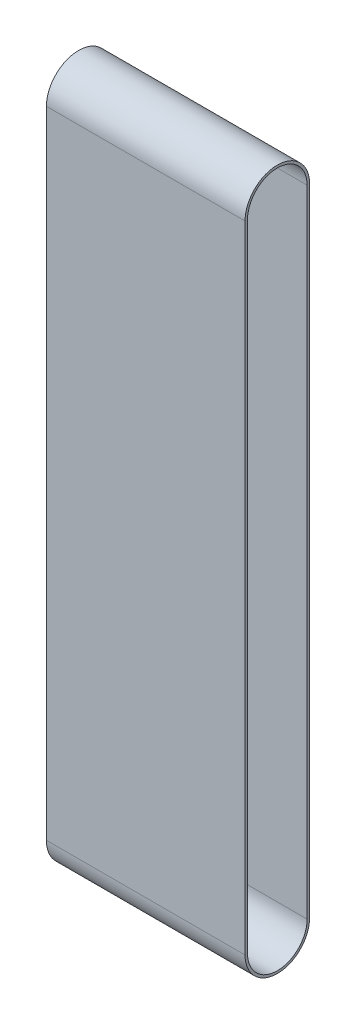
ISO-10303-21;
HEADER;
FILE_DESCRIPTION(('STEP AP214'),'2;1');
FILE_NAME('part.step','',(''),(''),'','','');
FILE_SCHEMA(('AUTOMOTIVE_DESIGN { 1 0 10303 214 1 1 1 1 }'));
ENDSEC;
DATA;
#1=APPLICATION_CONTEXT('core data for automotive mechanical design processes');
#2=APPLICATION_PROTOCOL_DEFINITION('international standard','automotive_design',2000,#1);
#3=PRODUCT_CONTEXT('',#1,'mechanical');
#4=PRODUCT('Part','Part','',(#3));
#5=PRODUCT_RELATED_PRODUCT_CATEGORY('part','',(#4));
#6=PRODUCT_DEFINITION_FORMATION('','',#4);
#7=PRODUCT_DEFINITION_CONTEXT('part definition',#1,'design');
#8=PRODUCT_DEFINITION('design','',#6,#7);
#9=PRODUCT_DEFINITION_SHAPE('','',#8);
#10=(LENGTH_UNIT() NAMED_UNIT(*) SI_UNIT(.MILLI.,.METRE.));
#11=(NAMED_UNIT(*) PLANE_ANGLE_UNIT() SI_UNIT($,.RADIAN.));
#12=(NAMED_UNIT(*) SI_UNIT($,.STERADIAN.) SOLID_ANGLE_UNIT());
#13=UNCERTAINTY_MEASURE_WITH_UNIT(LENGTH_MEASURE(1.E-05),#10,'distance_accuracy_value','');
#14=(GEOMETRIC_REPRESENTATION_CONTEXT(3) GLOBAL_UNCERTAINTY_ASSIGNED_CONTEXT((#13)) GLOBAL_UNIT_ASSIGNED_CONTEXT((#10,
#11,#12)) REPRESENTATION_CONTEXT('',''));
#15=CARTESIAN_POINT('',(0.,0.,0.));
#16=DIRECTION('',(0.,0.,1.));
#17=DIRECTION('',(1.,0.,0.));
#18=AXIS2_PLACEMENT_3D('',#15,#16,#17);
#19=CARTESIAN_POINT('',(254.,254.,-330.2));
#20=DIRECTION('',(1.,0.,0.));
#21=DIRECTION('',(0.,0.,-1.));
#22=AXIS2_PLACEMENT_3D('',#19,#20,#21);
#23=PLANE('',#22);
#24=CARTESIAN_POINT('',(254.,254.,-330.2));
#25=DIRECTION('',(1.,0.,0.));
#26=DIRECTION('',(0.,0.,-1.));
#27=AXIS2_PLACEMENT_3D('',#24,#25,#26);
#28=CIRCLE('',#27,82.5500000000001);
#29=CARTESIAN_POINT('',(254.,254.,-247.65));
#30=VERTEX_POINT('',#29);
#31=CARTESIAN_POINT('',(254.,254.,-412.750000000001));
#32=VERTEX_POINT('',#31);
#33=EDGE_CURVE('E136',#30,#32,#28,.T.);
#34=ORIENTED_EDGE('',*,*,#33,.T.);
#35=DIRECTION('',(0.,1.,0.));
#36=VECTOR('',#35,1.);
#37=CARTESIAN_POINT('',(254.,1879.6,-412.75));
#38=LINE('',#37,#36);
#39=CARTESIAN_POINT('',(254.,1879.6,-412.75));
#40=VERTEX_POINT('',#39);
#41=EDGE_CURVE('E139',#32,#40,#38,.T.);
#42=ORIENTED_EDGE('',*,*,#41,.T.);
#43=CARTESIAN_POINT('',(254.,1879.6,-330.2));
#44=DIRECTION('',(1.,0.,0.));
#45=DIRECTION('',(0.,0.,-1.));
#46=AXIS2_PLACEMENT_3D('',#43,#44,#45);
#47=CIRCLE('',#46,82.55);
#48=CARTESIAN_POINT('',(254.,1879.6,-247.65));
#49=VERTEX_POINT('',#48);
#50=EDGE_CURVE('E142',#40,#49,#47,.T.);
#51=ORIENTED_EDGE('',*,*,#50,.T.);
#52=DIRECTION('',(0.,-1.,0.));
#53=VECTOR('',#52,1.);
#54=CARTESIAN_POINT('',(254.,254.,-247.65));
#55=LINE('',#54,#53);
#56=EDGE_CURVE('E144',#49,#30,#55,.T.);
#57=ORIENTED_EDGE('',*,*,#56,.T.);
#58=EDGE_LOOP('',(#34,#42,#51,#57));
#59=FACE_BOUND('',#58,.T.);
#60=DIRECTION('',(0.,-1.,0.));
#61=VECTOR('',#60,1.);
#62=CARTESIAN_POINT('',(254.,254.,-254.));
#63=LINE('',#62,#61);
#64=CARTESIAN_POINT('',(254.,1879.6,-254.));
#65=VERTEX_POINT('',#64);
#66=CARTESIAN_POINT('',(254.,254.,-254.));
#67=VERTEX_POINT('',#66);
#68=EDGE_CURVE('E108',#65,#67,#63,.T.);
#69=ORIENTED_EDGE('',*,*,#68,.F.);
#70=CARTESIAN_POINT('',(254.,1879.6,-330.2));
#71=DIRECTION('',(1.,0.,0.));
#72=DIRECTION('',(0.,0.,-1.));
#73=AXIS2_PLACEMENT_3D('',#70,#71,#72);
#74=CIRCLE('',#73,76.2);
#75=CARTESIAN_POINT('',(254.,1879.6,-406.4));
#76=VERTEX_POINT('',#75);
#77=EDGE_CURVE('E100',#76,#65,#74,.T.);
#78=ORIENTED_EDGE('',*,*,#77,.F.);
#79=DIRECTION('',(0.,1.,0.));
#80=VECTOR('',#79,1.);
#81=CARTESIAN_POINT('',(254.,1879.6,-406.4));
#82=LINE('',#81,#80);
#83=CARTESIAN_POINT('',(254.,254.,-406.400000000001));
#84=VERTEX_POINT('',#83);
#85=EDGE_CURVE('E122',#84,#76,#82,.T.);
#86=ORIENTED_EDGE('',*,*,#85,.F.);
#87=CARTESIAN_POINT('',(254.,254.,-330.2));
#88=DIRECTION('',(1.,0.,0.));
#89=DIRECTION('',(0.,0.,-1.));
#90=AXIS2_PLACEMENT_3D('',#87,#88,#89);
#91=CIRCLE('',#90,76.2000000000001);
#92=EDGE_CURVE('E120',#67,#84,#91,.T.);
#93=ORIENTED_EDGE('',*,*,#92,.F.);
#94=EDGE_LOOP('',(#69,#78,#86,#93));
#95=FACE_BOUND('',#94,.T.);
#96=ADVANCED_FACE('F35',(#59,#95),#23,.T.);
#97=CARTESIAN_POINT('',(-254.,254.,-330.2));
#98=DIRECTION('',(1.,0.,0.));
#99=DIRECTION('',(0.,0.,-1.));
#100=AXIS2_PLACEMENT_3D('',#97,#98,#99);
#101=PLANE('',#100);
#102=CARTESIAN_POINT('',(-254.,254.,-330.2));
#103=DIRECTION('',(1.,0.,0.));
#104=DIRECTION('',(0.,0.,-1.));
#105=AXIS2_PLACEMENT_3D('',#102,#103,#104);
#106=CIRCLE('',#105,82.5500000000001);
#107=CARTESIAN_POINT('',(-254.,254.,-247.65));
#108=VERTEX_POINT('',#107);
#109=CARTESIAN_POINT('',(-254.,254.,-412.750000000001));
#110=VERTEX_POINT('',#109);
#111=EDGE_CURVE('E116',#108,#110,#106,.T.);
#112=ORIENTED_EDGE('',*,*,#111,.F.);
#113=DIRECTION('',(0.,-1.,0.));
#114=VECTOR('',#113,1.);
#115=CARTESIAN_POINT('',(-254.,254.,-247.65));
#116=LINE('',#115,#114);
#117=CARTESIAN_POINT('',(-254.,1879.6,-247.65));
#118=VERTEX_POINT('',#117);
#119=EDGE_CURVE('E140',#118,#108,#116,.T.);
#120=ORIENTED_EDGE('',*,*,#119,.F.);
#121=CARTESIAN_POINT('',(-254.,1879.6,-330.2));
#122=DIRECTION('',(1.,0.,0.));
#123=DIRECTION('',(0.,0.,-1.));
#124=AXIS2_PLACEMENT_3D('',#121,#122,#123);
#125=CIRCLE('',#124,82.55);
#126=CARTESIAN_POINT('',(-254.,1879.6,-412.75));
#127=VERTEX_POINT('',#126);
#128=EDGE_CURVE('E151',#127,#118,#125,.T.);
#129=ORIENTED_EDGE('',*,*,#128,.F.);
#130=DIRECTION('',(0.,1.,0.));
#131=VECTOR('',#130,1.);
#132=CARTESIAN_POINT('',(-254.,1879.6,-412.75));
#133=LINE('',#132,#131);
#134=EDGE_CURVE('E149',#110,#127,#133,.T.);
#135=ORIENTED_EDGE('',*,*,#134,.F.);
#136=EDGE_LOOP('',(#112,#120,#129,#135));
#137=FACE_BOUND('',#136,.T.);
#138=CARTESIAN_POINT('',(-254.,1879.6,-330.2));
#139=DIRECTION('',(1.,0.,0.));
#140=DIRECTION('',(0.,0.,-1.));
#141=AXIS2_PLACEMENT_3D('',#138,#139,#140);
#142=CIRCLE('',#141,76.2);
#143=CARTESIAN_POINT('',(-254.,1879.6,-406.4));
#144=VERTEX_POINT('',#143);
#145=CARTESIAN_POINT('',(-254.,1879.6,-254.));
#146=VERTEX_POINT('',#145);
#147=EDGE_CURVE('E58',#144,#146,#142,.T.);
#148=ORIENTED_EDGE('',*,*,#147,.T.);
#149=DIRECTION('',(0.,-1.,0.));
#150=VECTOR('',#149,1.);
#151=CARTESIAN_POINT('',(-254.,254.,-254.));
#152=LINE('',#151,#150);
#153=CARTESIAN_POINT('',(-254.,254.,-254.));
#154=VERTEX_POINT('',#153);
#155=EDGE_CURVE('E115',#146,#154,#152,.T.);
#156=ORIENTED_EDGE('',*,*,#155,.T.);
#157=CARTESIAN_POINT('',(-254.,254.,-330.2));
#158=DIRECTION('',(1.,0.,0.));
#159=DIRECTION('',(0.,0.,-1.));
#160=AXIS2_PLACEMENT_3D('',#157,#158,#159);
#161=CIRCLE('',#160,76.2000000000001);
#162=CARTESIAN_POINT('',(-254.,254.,-406.400000000001));
#163=VERTEX_POINT('',#162);
#164=EDGE_CURVE('E128',#154,#163,#161,.T.);
#165=ORIENTED_EDGE('',*,*,#164,.T.);
#166=DIRECTION('',(0.,1.,0.));
#167=VECTOR('',#166,1.);
#168=CARTESIAN_POINT('',(-254.,1879.6,-406.4));
#169=LINE('',#168,#167);
#170=EDGE_CURVE('E109',#163,#144,#169,.T.);
#171=ORIENTED_EDGE('',*,*,#170,.T.);
#172=EDGE_LOOP('',(#148,#156,#165,#171));
#173=FACE_BOUND('',#172,.T.);
#174=ADVANCED_FACE('F169',(#137,#173),#101,.F.);
#175=CARTESIAN_POINT('',(254.,254.,-330.2));
#176=DIRECTION('',(-1.,0.,0.));
#177=DIRECTION('',(0.,0.,1.));
#178=AXIS2_PLACEMENT_3D('',#175,#176,#177);
#179=CYLINDRICAL_SURFACE('',#178,82.5500000000001);
#180=ORIENTED_EDGE('',*,*,#111,.T.);
#181=DIRECTION('',(-1.,0.,0.));
#182=VECTOR('',#181,1.);
#183=CARTESIAN_POINT('',(254.,254.,-412.750000000001));
#184=LINE('',#183,#182);
#185=EDGE_CURVE('E11',#32,#110,#184,.T.);
#186=ORIENTED_EDGE('',*,*,#185,.F.);
#187=ORIENTED_EDGE('',*,*,#33,.F.);
#188=DIRECTION('',(-1.,0.,0.));
#189=VECTOR('',#188,1.);
#190=CARTESIAN_POINT('',(254.,254.,-247.65));
#191=LINE('',#190,#189);
#192=EDGE_CURVE('E146',#30,#108,#191,.T.);
#193=ORIENTED_EDGE('',*,*,#192,.T.);
#194=EDGE_LOOP('',(#180,#186,#187,#193));
#195=FACE_BOUND('',#194,.T.);
#196=ADVANCED_FACE('F37',(#195),#179,.T.);
#197=CARTESIAN_POINT('',(254.,1879.6,-412.75));
#198=DIRECTION('',(0.,0.,1.));
#199=DIRECTION('',(0.,-1.,0.));
#200=AXIS2_PLACEMENT_3D('',#197,#198,#199);
#201=PLANE('',#200);
#202=ORIENTED_EDGE('',*,*,#134,.T.);
#203=DIRECTION('',(-1.,0.,0.));
#204=VECTOR('',#203,1.);
#205=CARTESIAN_POINT('',(254.,1879.6,-412.75));
#206=LINE('',#205,#204);
#207=EDGE_CURVE('E43',#40,#127,#206,.T.);
#208=ORIENTED_EDGE('',*,*,#207,.F.);
#209=ORIENTED_EDGE('',*,*,#41,.F.);
#210=ORIENTED_EDGE('',*,*,#185,.T.);
#211=EDGE_LOOP('',(#202,#208,#209,#210));
#212=FACE_BOUND('',#211,.T.);
#213=ADVANCED_FACE('F179',(#212),#201,.F.);
#214=CARTESIAN_POINT('',(254.,1879.6,-330.2));
#215=DIRECTION('',(-1.,0.,0.));
#216=DIRECTION('',(0.,0.,1.));
#217=AXIS2_PLACEMENT_3D('',#214,#215,#216);
#218=CYLINDRICAL_SURFACE('',#217,82.55);
#219=ORIENTED_EDGE('',*,*,#128,.T.);
#220=DIRECTION('',(-1.,0.,0.));
#221=VECTOR('',#220,1.);
#222=CARTESIAN_POINT('',(254.,1879.6,-247.65));
#223=LINE('',#222,#221);
#224=EDGE_CURVE('E156',#49,#118,#223,.T.);
#225=ORIENTED_EDGE('',*,*,#224,.F.);
#226=ORIENTED_EDGE('',*,*,#50,.F.);
#227=ORIENTED_EDGE('',*,*,#207,.T.);
#228=EDGE_LOOP('',(#219,#225,#226,#227));
#229=FACE_BOUND('',#228,.T.);
#230=ADVANCED_FACE('F163',(#229),#218,.T.);
#231=CARTESIAN_POINT('',(254.,254.,-247.65));
#232=DIRECTION('',(0.,0.,-1.));
#233=DIRECTION('',(-1.,0.,0.));
#234=AXIS2_PLACEMENT_3D('',#231,#232,#233);
#235=PLANE('',#234);
#236=ORIENTED_EDGE('',*,*,#119,.T.);
#237=ORIENTED_EDGE('',*,*,#192,.F.);
#238=ORIENTED_EDGE('',*,*,#56,.F.);
#239=ORIENTED_EDGE('',*,*,#224,.T.);
#240=EDGE_LOOP('',(#236,#237,#238,#239));
#241=FACE_BOUND('',#240,.T.);
#242=ADVANCED_FACE('F173',(#241),#235,.F.);
#243=CARTESIAN_POINT('',(254.,1879.6,-330.2));
#244=DIRECTION('',(-1.,0.,0.));
#245=DIRECTION('',(0.,0.,1.));
#246=AXIS2_PLACEMENT_3D('',#243,#244,#245);
#247=CYLINDRICAL_SURFACE('',#246,76.2);
#248=ORIENTED_EDGE('',*,*,#147,.F.);
#249=DIRECTION('',(-1.,0.,0.));
#250=VECTOR('',#249,1.);
#251=CARTESIAN_POINT('',(254.,1879.6,-406.4));
#252=LINE('',#251,#250);
#253=EDGE_CURVE('E104',#76,#144,#252,.T.);
#254=ORIENTED_EDGE('',*,*,#253,.F.);
#255=ORIENTED_EDGE('',*,*,#77,.T.);
#256=DIRECTION('',(-1.,0.,0.));
#257=VECTOR('',#256,1.);
#258=CARTESIAN_POINT('',(254.,1879.6,-254.));
#259=LINE('',#258,#257);
#260=EDGE_CURVE('E103',#65,#146,#259,.T.);
#261=ORIENTED_EDGE('',*,*,#260,.T.);
#262=EDGE_LOOP('',(#248,#254,#255,#261));
#263=FACE_BOUND('',#262,.T.);
#264=ADVANCED_FACE('F102',(#263),#247,.F.);
#265=CARTESIAN_POINT('',(254.,254.,-254.));
#266=DIRECTION('',(0.,0.,-1.));
#267=DIRECTION('',(-1.,0.,0.));
#268=AXIS2_PLACEMENT_3D('',#265,#266,#267);
#269=PLANE('',#268);
#270=ORIENTED_EDGE('',*,*,#155,.F.);
#271=ORIENTED_EDGE('',*,*,#260,.F.);
#272=ORIENTED_EDGE('',*,*,#68,.T.);
#273=DIRECTION('',(-1.,0.,0.));
#274=VECTOR('',#273,1.);
#275=CARTESIAN_POINT('',(254.,254.,-254.));
#276=LINE('',#275,#274);
#277=EDGE_CURVE('E117',#67,#154,#276,.T.);
#278=ORIENTED_EDGE('',*,*,#277,.T.);
#279=EDGE_LOOP('',(#270,#271,#272,#278));
#280=FACE_BOUND('',#279,.T.);
#281=ADVANCED_FACE('F112',(#280),#269,.T.);
#282=CARTESIAN_POINT('',(254.,254.,-330.2));
#283=DIRECTION('',(-1.,0.,0.));
#284=DIRECTION('',(0.,0.,1.));
#285=AXIS2_PLACEMENT_3D('',#282,#283,#284);
#286=CYLINDRICAL_SURFACE('',#285,76.2000000000001);
#287=ORIENTED_EDGE('',*,*,#164,.F.);
#288=ORIENTED_EDGE('',*,*,#277,.F.);
#289=ORIENTED_EDGE('',*,*,#92,.T.);
#290=DIRECTION('',(-1.,0.,0.));
#291=VECTOR('',#290,1.);
#292=CARTESIAN_POINT('',(254.,254.,-406.400000000001));
#293=LINE('',#292,#291);
#294=EDGE_CURVE('E50',#84,#163,#293,.T.);
#295=ORIENTED_EDGE('',*,*,#294,.T.);
#296=EDGE_LOOP('',(#287,#288,#289,#295));
#297=FACE_BOUND('',#296,.T.);
#298=ADVANCED_FACE('F202',(#297),#286,.F.);
#299=CARTESIAN_POINT('',(254.,1879.6,-406.4));
#300=DIRECTION('',(0.,0.,1.));
#301=DIRECTION('',(0.,-1.,0.));
#302=AXIS2_PLACEMENT_3D('',#299,#300,#301);
#303=PLANE('',#302);
#304=ORIENTED_EDGE('',*,*,#170,.F.);
#305=ORIENTED_EDGE('',*,*,#294,.F.);
#306=ORIENTED_EDGE('',*,*,#85,.T.);
#307=ORIENTED_EDGE('',*,*,#253,.T.);
#308=EDGE_LOOP('',(#304,#305,#306,#307));
#309=FACE_BOUND('',#308,.T.);
#310=ADVANCED_FACE('F206',(#309),#303,.T.);
#311=CLOSED_SHELL('',(#96,#174,#196,#213,#230,#242,#264,#281,#298,#310));
#312=MANIFOLD_SOLID_BREP('B2',#311);
#313=ADVANCED_BREP_SHAPE_REPRESENTATION('',(#18,#312),#14);
#314=SHAPE_DEFINITION_REPRESENTATION(#9,#313);
ENDSEC;
END-ISO-10303-21;
